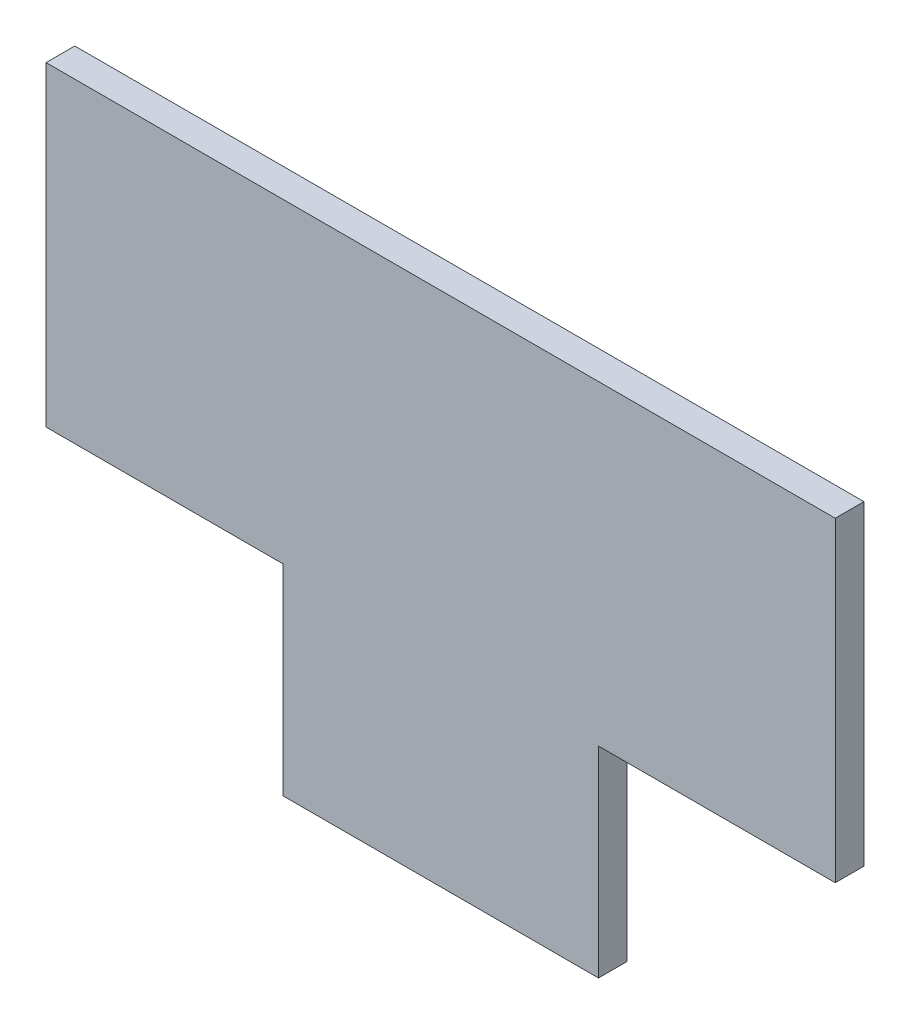
ISO-10303-21;
HEADER;
FILE_DESCRIPTION(('STEP AP214'),'2;1');
FILE_NAME('part.step','',(''),(''),'','','');
FILE_SCHEMA(('AUTOMOTIVE_DESIGN { 1 0 10303 214 1 1 1 1 }'));
ENDSEC;
DATA;
#1=APPLICATION_CONTEXT('core data for automotive mechanical design processes');
#2=APPLICATION_PROTOCOL_DEFINITION('international standard','automotive_design',2000,#1);
#3=PRODUCT_CONTEXT('',#1,'mechanical');
#4=PRODUCT('Part','Part','',(#3));
#5=PRODUCT_RELATED_PRODUCT_CATEGORY('part','',(#4));
#6=PRODUCT_DEFINITION_FORMATION('','',#4);
#7=PRODUCT_DEFINITION_CONTEXT('part definition',#1,'design');
#8=PRODUCT_DEFINITION('design','',#6,#7);
#9=PRODUCT_DEFINITION_SHAPE('','',#8);
#10=(LENGTH_UNIT() NAMED_UNIT(*) SI_UNIT(.MILLI.,.METRE.));
#11=(NAMED_UNIT(*) PLANE_ANGLE_UNIT() SI_UNIT($,.RADIAN.));
#12=(NAMED_UNIT(*) SI_UNIT($,.STERADIAN.) SOLID_ANGLE_UNIT());
#13=UNCERTAINTY_MEASURE_WITH_UNIT(LENGTH_MEASURE(1.E-05),#10,'distance_accuracy_value','');
#14=(GEOMETRIC_REPRESENTATION_CONTEXT(3) GLOBAL_UNCERTAINTY_ASSIGNED_CONTEXT((#13)) GLOBAL_UNIT_ASSIGNED_CONTEXT((#10,
#11,#12)) REPRESENTATION_CONTEXT('',''));
#15=CARTESIAN_POINT('',(0.,0.,0.));
#16=DIRECTION('',(0.,0.,1.));
#17=DIRECTION('',(1.,0.,0.));
#18=AXIS2_PLACEMENT_3D('',#15,#16,#17);
#19=CARTESIAN_POINT('',(-5.50000000000001,7.,1.));
#20=DIRECTION('',(1.,0.,0.));
#21=DIRECTION('',(0.,1.,0.));
#22=AXIS2_PLACEMENT_3D('',#19,#20,#21);
#23=PLANE('',#22);
#24=DIRECTION('',(0.,-1.,0.));
#25=VECTOR('',#24,1.);
#26=CARTESIAN_POINT('',(-5.50000000000001,7.,0.));
#27=LINE('',#26,#25);
#28=CARTESIAN_POINT('',(-5.50000000000001,7.,0.));
#29=VERTEX_POINT('',#28);
#30=CARTESIAN_POINT('',(-5.5,0.,0.));
#31=VERTEX_POINT('',#30);
#32=EDGE_CURVE('E130',#29,#31,#27,.T.);
#33=ORIENTED_EDGE('',*,*,#32,.T.);
#34=DIRECTION('',(0.,0.,-1.));
#35=VECTOR('',#34,1.);
#36=CARTESIAN_POINT('',(-5.5,0.,1.));
#37=LINE('',#36,#35);
#38=CARTESIAN_POINT('',(-5.5,0.,1.));
#39=VERTEX_POINT('',#38);
#40=EDGE_CURVE('E11',#39,#31,#37,.T.);
#41=ORIENTED_EDGE('',*,*,#40,.F.);
#42=DIRECTION('',(0.,-1.,0.));
#43=VECTOR('',#42,1.);
#44=CARTESIAN_POINT('',(-5.50000000000001,7.,1.));
#45=LINE('',#44,#43);
#46=CARTESIAN_POINT('',(-5.50000000000001,7.,1.));
#47=VERTEX_POINT('',#46);
#48=EDGE_CURVE('E144',#47,#39,#45,.T.);
#49=ORIENTED_EDGE('',*,*,#48,.F.);
#50=DIRECTION('',(0.,0.,-1.));
#51=VECTOR('',#50,1.);
#52=CARTESIAN_POINT('',(-5.50000000000001,7.,1.));
#53=LINE('',#52,#51);
#54=EDGE_CURVE('E126',#47,#29,#53,.T.);
#55=ORIENTED_EDGE('',*,*,#54,.T.);
#56=EDGE_LOOP('',(#33,#41,#49,#55));
#57=FACE_BOUND('',#56,.T.);
#58=ADVANCED_FACE('F34',(#57),#23,.F.);
#59=CARTESIAN_POINT('',(-5.5,0.,1.));
#60=DIRECTION('',(0.,1.,0.));
#61=DIRECTION('',(0.,0.,1.));
#62=AXIS2_PLACEMENT_3D('',#59,#60,#61);
#63=PLANE('',#62);
#64=DIRECTION('',(1.,0.,0.));
#65=VECTOR('',#64,1.);
#66=CARTESIAN_POINT('',(-5.5,0.,0.));
#67=LINE('',#66,#65);
#68=CARTESIAN_POINT('',(5.5,0.,0.));
#69=VERTEX_POINT('',#68);
#70=EDGE_CURVE('E133',#31,#69,#67,.T.);
#71=ORIENTED_EDGE('',*,*,#70,.T.);
#72=DIRECTION('',(0.,0.,-1.));
#73=VECTOR('',#72,1.);
#74=CARTESIAN_POINT('',(5.5,0.,1.));
#75=LINE('',#74,#73);
#76=CARTESIAN_POINT('',(5.5,0.,1.));
#77=VERTEX_POINT('',#76);
#78=EDGE_CURVE('E42',#77,#69,#75,.T.);
#79=ORIENTED_EDGE('',*,*,#78,.F.);
#80=DIRECTION('',(1.,0.,0.));
#81=VECTOR('',#80,1.);
#82=CARTESIAN_POINT('',(-5.5,0.,1.));
#83=LINE('',#82,#81);
#84=EDGE_CURVE('E93',#39,#77,#83,.T.);
#85=ORIENTED_EDGE('',*,*,#84,.F.);
#86=ORIENTED_EDGE('',*,*,#40,.T.);
#87=EDGE_LOOP('',(#71,#79,#85,#86));
#88=FACE_BOUND('',#87,.T.);
#89=ADVANCED_FACE('F179',(#88),#63,.F.);
#90=CARTESIAN_POINT('',(5.5,0.,1.));
#91=DIRECTION('',(-1.,0.,0.));
#92=DIRECTION('',(0.,-1.,0.));
#93=AXIS2_PLACEMENT_3D('',#90,#91,#92);
#94=PLANE('',#93);
#95=DIRECTION('',(0.,1.,0.));
#96=VECTOR('',#95,1.);
#97=CARTESIAN_POINT('',(5.5,0.,0.));
#98=LINE('',#97,#96);
#99=CARTESIAN_POINT('',(5.5,7.,0.));
#100=VERTEX_POINT('',#99);
#101=EDGE_CURVE('E135',#69,#100,#98,.T.);
#102=ORIENTED_EDGE('',*,*,#101,.T.);
#103=DIRECTION('',(0.,0.,-1.));
#104=VECTOR('',#103,1.);
#105=CARTESIAN_POINT('',(5.5,7.,1.));
#106=LINE('',#105,#104);
#107=CARTESIAN_POINT('',(5.5,7.,1.));
#108=VERTEX_POINT('',#107);
#109=EDGE_CURVE('E151',#108,#100,#106,.T.);
#110=ORIENTED_EDGE('',*,*,#109,.F.);
#111=DIRECTION('',(0.,1.,0.));
#112=VECTOR('',#111,1.);
#113=CARTESIAN_POINT('',(5.5,0.,1.));
#114=LINE('',#113,#112);
#115=EDGE_CURVE('E159',#77,#108,#114,.T.);
#116=ORIENTED_EDGE('',*,*,#115,.F.);
#117=ORIENTED_EDGE('',*,*,#78,.T.);
#118=EDGE_LOOP('',(#102,#110,#116,#117));
#119=FACE_BOUND('',#118,.T.);
#120=ADVANCED_FACE('F157',(#119),#94,.F.);
#121=CARTESIAN_POINT('',(5.5,7.,1.));
#122=DIRECTION('',(0.,1.,0.));
#123=DIRECTION('',(-1.,0.,0.));
#124=AXIS2_PLACEMENT_3D('',#121,#122,#123);
#125=PLANE('',#124);
#126=DIRECTION('',(1.,0.,0.));
#127=VECTOR('',#126,1.);
#128=CARTESIAN_POINT('',(5.5,7.,0.));
#129=LINE('',#128,#127);
#130=CARTESIAN_POINT('',(13.75,7.,0.));
#131=VERTEX_POINT('',#130);
#132=EDGE_CURVE('E137',#100,#131,#129,.T.);
#133=ORIENTED_EDGE('',*,*,#132,.T.);
#134=DIRECTION('',(0.,0.,-1.));
#135=VECTOR('',#134,1.);
#136=CARTESIAN_POINT('',(13.75,7.,1.));
#137=LINE('',#136,#135);
#138=CARTESIAN_POINT('',(13.75,7.,1.));
#139=VERTEX_POINT('',#138);
#140=EDGE_CURVE('E148',#139,#131,#137,.T.);
#141=ORIENTED_EDGE('',*,*,#140,.F.);
#142=DIRECTION('',(1.,0.,0.));
#143=VECTOR('',#142,1.);
#144=CARTESIAN_POINT('',(5.5,7.,1.));
#145=LINE('',#144,#143);
#146=EDGE_CURVE('E171',#108,#139,#145,.T.);
#147=ORIENTED_EDGE('',*,*,#146,.F.);
#148=ORIENTED_EDGE('',*,*,#109,.T.);
#149=EDGE_LOOP('',(#133,#141,#147,#148));
#150=FACE_BOUND('',#149,.T.);
#151=ADVANCED_FACE('F167',(#150),#125,.F.);
#152=CARTESIAN_POINT('',(13.75,7.,1.));
#153=DIRECTION('',(-1.,0.,0.));
#154=DIRECTION('',(0.,-1.,0.));
#155=AXIS2_PLACEMENT_3D('',#152,#153,#154);
#156=PLANE('',#155);
#157=DIRECTION('',(0.,1.,0.));
#158=VECTOR('',#157,1.);
#159=CARTESIAN_POINT('',(13.75,7.,0.));
#160=LINE('',#159,#158);
#161=CARTESIAN_POINT('',(13.75,18.,0.));
#162=VERTEX_POINT('',#161);
#163=EDGE_CURVE('E139',#131,#162,#160,.T.);
#164=ORIENTED_EDGE('',*,*,#163,.T.);
#165=DIRECTION('',(0.,0.,-1.));
#166=VECTOR('',#165,1.);
#167=CARTESIAN_POINT('',(13.75,18.,1.));
#168=LINE('',#167,#166);
#169=CARTESIAN_POINT('',(13.75,18.,1.));
#170=VERTEX_POINT('',#169);
#171=EDGE_CURVE('E121',#170,#162,#168,.T.);
#172=ORIENTED_EDGE('',*,*,#171,.F.);
#173=DIRECTION('',(0.,1.,0.));
#174=VECTOR('',#173,1.);
#175=CARTESIAN_POINT('',(13.75,7.,1.));
#176=LINE('',#175,#174);
#177=EDGE_CURVE('E112',#139,#170,#176,.T.);
#178=ORIENTED_EDGE('',*,*,#177,.F.);
#179=ORIENTED_EDGE('',*,*,#140,.T.);
#180=EDGE_LOOP('',(#164,#172,#178,#179));
#181=FACE_BOUND('',#180,.T.);
#182=ADVANCED_FACE('F170',(#181),#156,.F.);
#183=CARTESIAN_POINT('',(13.75,18.,1.));
#184=DIRECTION('',(0.,-1.,0.));
#185=DIRECTION('',(1.,0.,0.));
#186=AXIS2_PLACEMENT_3D('',#183,#184,#185);
#187=PLANE('',#186);
#188=DIRECTION('',(-1.,0.,0.));
#189=VECTOR('',#188,1.);
#190=CARTESIAN_POINT('',(13.75,18.,0.));
#191=LINE('',#190,#189);
#192=CARTESIAN_POINT('',(-13.75,18.,0.));
#193=VERTEX_POINT('',#192);
#194=EDGE_CURVE('E120',#162,#193,#191,.T.);
#195=ORIENTED_EDGE('',*,*,#194,.T.);
#196=DIRECTION('',(0.,0.,-1.));
#197=VECTOR('',#196,1.);
#198=CARTESIAN_POINT('',(-13.75,18.,1.));
#199=LINE('',#198,#197);
#200=CARTESIAN_POINT('',(-13.75,18.,1.));
#201=VERTEX_POINT('',#200);
#202=EDGE_CURVE('E117',#201,#193,#199,.T.);
#203=ORIENTED_EDGE('',*,*,#202,.F.);
#204=DIRECTION('',(-1.,0.,0.));
#205=VECTOR('',#204,1.);
#206=CARTESIAN_POINT('',(13.75,18.,1.));
#207=LINE('',#206,#205);
#208=EDGE_CURVE('E106',#170,#201,#207,.T.);
#209=ORIENTED_EDGE('',*,*,#208,.F.);
#210=ORIENTED_EDGE('',*,*,#171,.T.);
#211=EDGE_LOOP('',(#195,#203,#209,#210));
#212=FACE_BOUND('',#211,.T.);
#213=ADVANCED_FACE('F118',(#212),#187,.F.);
#214=CARTESIAN_POINT('',(-13.75,18.,1.));
#215=DIRECTION('',(1.,0.,0.));
#216=DIRECTION('',(0.,0.,-1.));
#217=AXIS2_PLACEMENT_3D('',#214,#215,#216);
#218=PLANE('',#217);
#219=DIRECTION('',(0.,-1.,0.));
#220=VECTOR('',#219,1.);
#221=CARTESIAN_POINT('',(-13.75,18.,0.));
#222=LINE('',#221,#220);
#223=CARTESIAN_POINT('',(-13.75,7.,0.));
#224=VERTEX_POINT('',#223);
#225=EDGE_CURVE('E79',#193,#224,#222,.T.);
#226=ORIENTED_EDGE('',*,*,#225,.T.);
#227=DIRECTION('',(0.,0.,-1.));
#228=VECTOR('',#227,1.);
#229=CARTESIAN_POINT('',(-13.75,7.,1.));
#230=LINE('',#229,#228);
#231=CARTESIAN_POINT('',(-13.75,7.,1.));
#232=VERTEX_POINT('',#231);
#233=EDGE_CURVE('E122',#232,#224,#230,.T.);
#234=ORIENTED_EDGE('',*,*,#233,.F.);
#235=DIRECTION('',(0.,-1.,0.));
#236=VECTOR('',#235,1.);
#237=CARTESIAN_POINT('',(-13.75,18.,1.));
#238=LINE('',#237,#236);
#239=EDGE_CURVE('E110',#201,#232,#238,.T.);
#240=ORIENTED_EDGE('',*,*,#239,.F.);
#241=ORIENTED_EDGE('',*,*,#202,.T.);
#242=EDGE_LOOP('',(#226,#234,#240,#241));
#243=FACE_BOUND('',#242,.T.);
#244=ADVANCED_FACE('F124',(#243),#218,.F.);
#245=CARTESIAN_POINT('',(-13.75,7.,1.));
#246=DIRECTION('',(0.,1.,0.));
#247=DIRECTION('',(-1.,0.,0.));
#248=AXIS2_PLACEMENT_3D('',#245,#246,#247);
#249=PLANE('',#248);
#250=DIRECTION('',(1.,0.,0.));
#251=VECTOR('',#250,1.);
#252=CARTESIAN_POINT('',(-13.75,7.,0.));
#253=LINE('',#252,#251);
#254=EDGE_CURVE('E85',#224,#29,#253,.T.);
#255=ORIENTED_EDGE('',*,*,#254,.T.);
#256=ORIENTED_EDGE('',*,*,#54,.F.);
#257=DIRECTION('',(1.,0.,0.));
#258=VECTOR('',#257,1.);
#259=CARTESIAN_POINT('',(-13.75,7.,1.));
#260=LINE('',#259,#258);
#261=EDGE_CURVE('E50',#232,#47,#260,.T.);
#262=ORIENTED_EDGE('',*,*,#261,.F.);
#263=ORIENTED_EDGE('',*,*,#233,.T.);
#264=EDGE_LOOP('',(#255,#256,#262,#263));
#265=FACE_BOUND('',#264,.T.);
#266=ADVANCED_FACE('F195',(#265),#249,.F.);
#267=CARTESIAN_POINT('',(0.,0.,1.));
#268=DIRECTION('',(0.,0.,1.));
#269=DIRECTION('',(1.,0.,0.));
#270=AXIS2_PLACEMENT_3D('',#267,#268,#269);
#271=PLANE('',#270);
#272=ORIENTED_EDGE('',*,*,#48,.T.);
#273=ORIENTED_EDGE('',*,*,#84,.T.);
#274=ORIENTED_EDGE('',*,*,#115,.T.);
#275=ORIENTED_EDGE('',*,*,#146,.T.);
#276=ORIENTED_EDGE('',*,*,#177,.T.);
#277=ORIENTED_EDGE('',*,*,#208,.T.);
#278=ORIENTED_EDGE('',*,*,#239,.T.);
#279=ORIENTED_EDGE('',*,*,#261,.T.);
#280=EDGE_LOOP('',(#272,#273,#274,#275,#276,#277,#278,#279));
#281=FACE_BOUND('',#280,.T.);
#282=ADVANCED_FACE('F108',(#281),#271,.T.);
#283=CARTESIAN_POINT('',(0.,0.,0.));
#284=DIRECTION('',(0.,0.,1.));
#285=DIRECTION('',(1.,0.,0.));
#286=AXIS2_PLACEMENT_3D('',#283,#284,#285);
#287=PLANE('',#286);
#288=ORIENTED_EDGE('',*,*,#32,.F.);
#289=ORIENTED_EDGE('',*,*,#254,.F.);
#290=ORIENTED_EDGE('',*,*,#225,.F.);
#291=ORIENTED_EDGE('',*,*,#194,.F.);
#292=ORIENTED_EDGE('',*,*,#163,.F.);
#293=ORIENTED_EDGE('',*,*,#132,.F.);
#294=ORIENTED_EDGE('',*,*,#101,.F.);
#295=ORIENTED_EDGE('',*,*,#70,.F.);
#296=EDGE_LOOP('',(#288,#289,#290,#291,#292,#293,#294,#295));
#297=FACE_BOUND('',#296,.T.);
#298=ADVANCED_FACE('F163',(#297),#287,.F.);
#299=CLOSED_SHELL('',(#58,#89,#120,#151,#182,#213,#244,#266,#282,#298));
#300=MANIFOLD_SOLID_BREP('B2',#299);
#301=ADVANCED_BREP_SHAPE_REPRESENTATION('',(#18,#300),#14);
#302=SHAPE_DEFINITION_REPRESENTATION(#9,#301);
ENDSEC;
END-ISO-10303-21;
